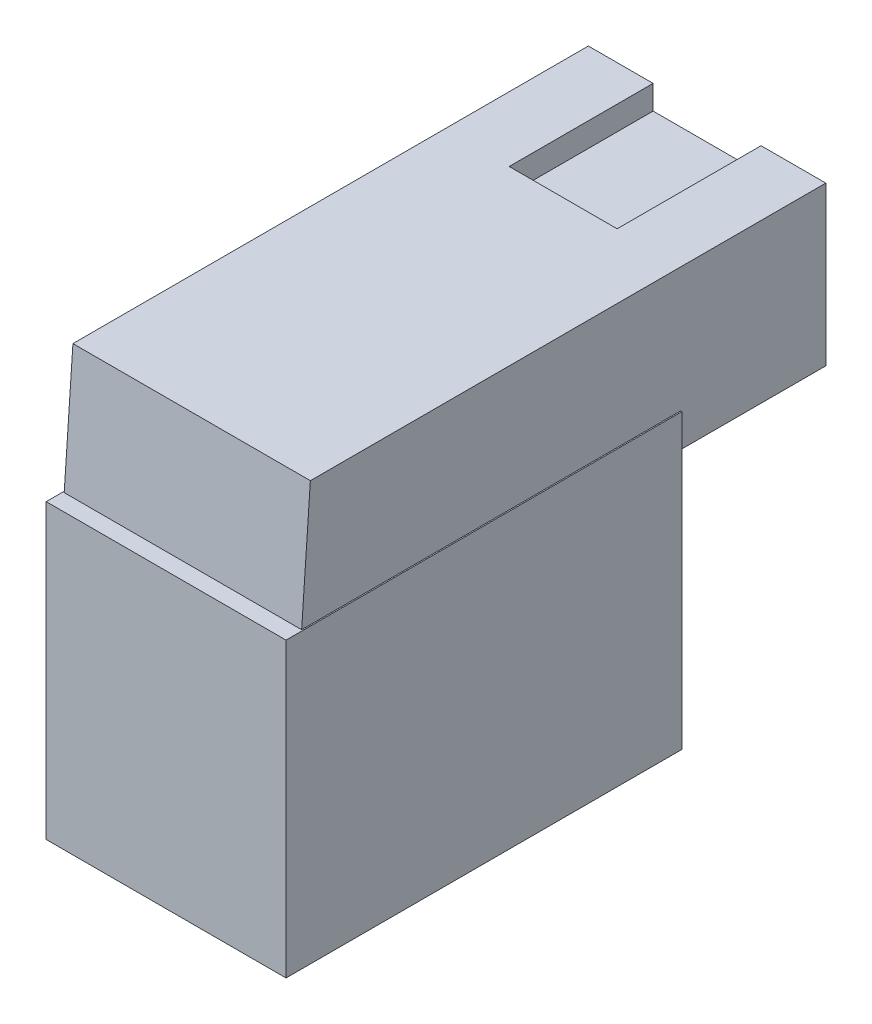
ISO-10303-21;
HEADER;
FILE_DESCRIPTION(('STEP AP214'),'2;1');
FILE_NAME('part.step','',(''),(''),'','','');
FILE_SCHEMA(('AUTOMOTIVE_DESIGN { 1 0 10303 214 1 1 1 1 }'));
ENDSEC;
DATA;
#1=APPLICATION_CONTEXT('core data for automotive mechanical design processes');
#2=APPLICATION_PROTOCOL_DEFINITION('international standard','automotive_design',2000,#1);
#3=PRODUCT_CONTEXT('',#1,'mechanical');
#4=PRODUCT('Part','Part','',(#3));
#5=PRODUCT_RELATED_PRODUCT_CATEGORY('part','',(#4));
#6=PRODUCT_DEFINITION_FORMATION('','',#4);
#7=PRODUCT_DEFINITION_CONTEXT('part definition',#1,'design');
#8=PRODUCT_DEFINITION('design','',#6,#7);
#9=PRODUCT_DEFINITION_SHAPE('','',#8);
#10=(LENGTH_UNIT() NAMED_UNIT(*) SI_UNIT(.MILLI.,.METRE.));
#11=(NAMED_UNIT(*) PLANE_ANGLE_UNIT() SI_UNIT($,.RADIAN.));
#12=(NAMED_UNIT(*) SI_UNIT($,.STERADIAN.) SOLID_ANGLE_UNIT());
#13=UNCERTAINTY_MEASURE_WITH_UNIT(LENGTH_MEASURE(1.E-05),#10,'distance_accuracy_value','');
#14=(GEOMETRIC_REPRESENTATION_CONTEXT(3) GLOBAL_UNCERTAINTY_ASSIGNED_CONTEXT((#13)) GLOBAL_UNIT_ASSIGNED_CONTEXT((#10,
#11,#12)) REPRESENTATION_CONTEXT('',''));
#15=CARTESIAN_POINT('',(0.,0.,0.));
#16=DIRECTION('',(0.,0.,1.));
#17=DIRECTION('',(1.,0.,0.));
#18=AXIS2_PLACEMENT_3D('',#15,#16,#17);
#19=CARTESIAN_POINT('',(0.,0.,-16.5536194221063));
#20=DIRECTION('',(0.,0.,1.));
#21=DIRECTION('',(1.,0.,0.));
#22=AXIS2_PLACEMENT_3D('',#19,#20,#21);
#23=PLANE('',#22);
#24=DIRECTION('',(0.,-1.,0.));
#25=VECTOR('',#24,1.);
#26=CARTESIAN_POINT('',(1.75,14.3,-16.5536194221063));
#27=LINE('',#26,#25);
#28=CARTESIAN_POINT('',(1.75,14.3,-16.5536194221063));
#29=VERTEX_POINT('',#28);
#30=CARTESIAN_POINT('',(1.75,13.3,-16.5536194221063));
#31=VERTEX_POINT('',#30);
#32=EDGE_CURVE('E258',#29,#31,#27,.T.);
#33=ORIENTED_EDGE('',*,*,#32,.F.);
#34=DIRECTION('',(1.,0.,0.));
#35=VECTOR('',#34,1.);
#36=CARTESIAN_POINT('',(1.75,14.3,-16.5536194221063));
#37=LINE('',#36,#35);
#38=CARTESIAN_POINT('',(0.749999999999999,14.3,-16.5536194221063));
#39=VERTEX_POINT('',#38);
#40=EDGE_CURVE('E275',#39,#29,#37,.T.);
#41=ORIENTED_EDGE('',*,*,#40,.F.);
#42=DIRECTION('',(0.,1.,0.));
#43=VECTOR('',#42,1.);
#44=CARTESIAN_POINT('',(0.749999999999999,14.3,-16.5536194221063));
#45=LINE('',#44,#43);
#46=CARTESIAN_POINT('',(0.749999999999999,13.3,-16.5536194221063));
#47=VERTEX_POINT('',#46);
#48=EDGE_CURVE('E284',#47,#39,#45,.T.);
#49=ORIENTED_EDGE('',*,*,#48,.F.);
#50=DIRECTION('',(-1.,0.,0.));
#51=VECTOR('',#50,1.);
#52=CARTESIAN_POINT('',(1.75,13.3,-16.5536194221063));
#53=LINE('',#52,#51);
#54=EDGE_CURVE('E261',#31,#47,#53,.T.);
#55=ORIENTED_EDGE('',*,*,#54,.F.);
#56=EDGE_LOOP('',(#33,#41,#49,#55));
#57=FACE_BOUND('',#56,.T.);
#58=DIRECTION('',(0.,-1.,0.));
#59=VECTOR('',#58,1.);
#60=CARTESIAN_POINT('',(3.45,13.6,-16.5536194221063));
#61=LINE('',#60,#59);
#62=CARTESIAN_POINT('',(3.45,15.1,-16.5536194221063));
#63=VERTEX_POINT('',#62);
#64=CARTESIAN_POINT('',(3.45,13.6,-16.5536194221063));
#65=VERTEX_POINT('',#64);
#66=EDGE_CURVE('E296',#63,#65,#61,.T.);
#67=ORIENTED_EDGE('',*,*,#66,.T.);
#68=DIRECTION('',(-1.,0.,0.));
#69=VECTOR('',#68,1.);
#70=CARTESIAN_POINT('',(2.9,13.6,-16.5536194221063));
#71=LINE('',#70,#69);
#72=CARTESIAN_POINT('',(2.9,13.6,-16.5536194221063));
#73=VERTEX_POINT('',#72);
#74=EDGE_CURVE('E301',#65,#73,#71,.T.);
#75=ORIENTED_EDGE('',*,*,#74,.T.);
#76=DIRECTION('',(0.,-1.,0.));
#77=VECTOR('',#76,1.);
#78=CARTESIAN_POINT('',(2.9,11.9,-16.5536194221063));
#79=LINE('',#78,#77);
#80=CARTESIAN_POINT('',(2.9,11.9,-16.5536194221063));
#81=VERTEX_POINT('',#80);
#82=EDGE_CURVE('E304',#73,#81,#79,.T.);
#83=ORIENTED_EDGE('',*,*,#82,.T.);
#84=DIRECTION('',(-1.,0.,0.));
#85=VECTOR('',#84,1.);
#86=CARTESIAN_POINT('',(-2.9,11.9,-16.5536194221063));
#87=LINE('',#86,#85);
#88=CARTESIAN_POINT('',(-2.9,11.9,-16.5536194221063));
#89=VERTEX_POINT('',#88);
#90=EDGE_CURVE('E308',#81,#89,#87,.T.);
#91=ORIENTED_EDGE('',*,*,#90,.T.);
#92=DIRECTION('',(0.,1.,0.));
#93=VECTOR('',#92,1.);
#94=CARTESIAN_POINT('',(-2.9,13.6,-16.5536194221063));
#95=LINE('',#94,#93);
#96=CARTESIAN_POINT('',(-2.9,13.6,-16.5536194221063));
#97=VERTEX_POINT('',#96);
#98=EDGE_CURVE('E311',#89,#97,#95,.T.);
#99=ORIENTED_EDGE('',*,*,#98,.T.);
#100=DIRECTION('',(-1.,0.,0.));
#101=VECTOR('',#100,1.);
#102=CARTESIAN_POINT('',(-3.45,13.6,-16.5536194221063));
#103=LINE('',#102,#101);
#104=CARTESIAN_POINT('',(-3.45,13.6,-16.5536194221063));
#105=VERTEX_POINT('',#104);
#106=EDGE_CURVE('E313',#97,#105,#103,.T.);
#107=ORIENTED_EDGE('',*,*,#106,.T.);
#108=DIRECTION('',(0.,1.,0.));
#109=VECTOR('',#108,1.);
#110=CARTESIAN_POINT('',(-3.45,15.1,-16.5536194221063));
#111=LINE('',#110,#109);
#112=CARTESIAN_POINT('',(-3.45,15.1,-16.5536194221063));
#113=VERTEX_POINT('',#112);
#114=EDGE_CURVE('E320',#105,#113,#111,.T.);
#115=ORIENTED_EDGE('',*,*,#114,.T.);
#116=DIRECTION('',(1.,0.,0.));
#117=VECTOR('',#116,1.);
#118=CARTESIAN_POINT('',(3.45,15.1,-16.5536194221063));
#119=LINE('',#118,#117);
#120=EDGE_CURVE('E318',#113,#63,#119,.T.);
#121=ORIENTED_EDGE('',*,*,#120,.T.);
#122=EDGE_LOOP('',(#67,#75,#83,#91,#99,#107,#115,#121));
#123=FACE_BOUND('',#122,.T.);
#124=DIRECTION('',(0.,-1.,0.));
#125=VECTOR('',#124,1.);
#126=CARTESIAN_POINT('',(-0.750000000000001,14.3,-16.5536194221063));
#127=LINE('',#126,#125);
#128=CARTESIAN_POINT('',(-0.750000000000001,14.3,-16.5536194221063));
#129=VERTEX_POINT('',#128);
#130=CARTESIAN_POINT('',(-0.750000000000001,13.3,-16.5536194221063));
#131=VERTEX_POINT('',#130);
#132=EDGE_CURVE('E260',#129,#131,#127,.T.);
#133=ORIENTED_EDGE('',*,*,#132,.F.);
#134=DIRECTION('',(1.,0.,0.));
#135=VECTOR('',#134,1.);
#136=CARTESIAN_POINT('',(-0.750000000000001,14.3,-16.5536194221063));
#137=LINE('',#136,#135);
#138=CARTESIAN_POINT('',(-1.75,14.3,-16.5536194221063));
#139=VERTEX_POINT('',#138);
#140=EDGE_CURVE('E253',#139,#129,#137,.T.);
#141=ORIENTED_EDGE('',*,*,#140,.F.);
#142=DIRECTION('',(0.,1.,0.));
#143=VECTOR('',#142,1.);
#144=CARTESIAN_POINT('',(-1.75,14.3,-16.5536194221063));
#145=LINE('',#144,#143);
#146=CARTESIAN_POINT('',(-1.75,13.3,-16.5536194221063));
#147=VERTEX_POINT('',#146);
#148=EDGE_CURVE('E64',#147,#139,#145,.T.);
#149=ORIENTED_EDGE('',*,*,#148,.F.);
#150=DIRECTION('',(-1.,0.,0.));
#151=VECTOR('',#150,1.);
#152=CARTESIAN_POINT('',(-0.750000000000001,13.3,-16.5536194221063));
#153=LINE('',#152,#151);
#154=EDGE_CURVE('E57',#131,#147,#153,.T.);
#155=ORIENTED_EDGE('',*,*,#154,.F.);
#156=EDGE_LOOP('',(#133,#141,#149,#155));
#157=FACE_BOUND('',#156,.T.);
#158=ADVANCED_FACE('F41',(#57,#123,#157),#23,.F.);
#159=CARTESIAN_POINT('',(-5.,12.2,0.));
#160=DIRECTION('',(1.,0.,0.));
#161=DIRECTION('',(0.,0.,-1.));
#162=AXIS2_PLACEMENT_3D('',#159,#160,#161);
#163=PLANE('',#162);
#164=DIRECTION('',(0.,0.,1.));
#165=VECTOR('',#164,1.);
#166=CARTESIAN_POINT('',(-5.,0.,0.));
#167=LINE('',#166,#165);
#168=CARTESIAN_POINT('',(-5.,0.,-16.5));
#169=VERTEX_POINT('',#168);
#170=CARTESIAN_POINT('',(-5.,0.,0.));
#171=VERTEX_POINT('',#170);
#172=EDGE_CURVE('E433',#169,#171,#167,.T.);
#173=ORIENTED_EDGE('',*,*,#172,.T.);
#174=DIRECTION('',(0.,-1.,0.));
#175=VECTOR('',#174,1.);
#176=CARTESIAN_POINT('',(-5.,12.2,0.));
#177=LINE('',#176,#175);
#178=CARTESIAN_POINT('',(-5.,12.2,0.));
#179=VERTEX_POINT('',#178);
#180=EDGE_CURVE('E11',#179,#171,#177,.T.);
#181=ORIENTED_EDGE('',*,*,#180,.F.);
#182=DIRECTION('',(0.,0.,1.));
#183=VECTOR('',#182,1.);
#184=CARTESIAN_POINT('',(-5.,12.2,0.));
#185=LINE('',#184,#183);
#186=CARTESIAN_POINT('',(-5.,12.2,-16.5));
#187=VERTEX_POINT('',#186);
#188=EDGE_CURVE('E432',#187,#179,#185,.T.);
#189=ORIENTED_EDGE('',*,*,#188,.F.);
#190=DIRECTION('',(0.,-1.,0.));
#191=VECTOR('',#190,1.);
#192=CARTESIAN_POINT('',(-5.,12.2,-16.5));
#193=LINE('',#192,#191);
#194=EDGE_CURVE('E447',#187,#169,#193,.T.);
#195=ORIENTED_EDGE('',*,*,#194,.T.);
#196=EDGE_LOOP('',(#173,#181,#189,#195));
#197=FACE_BOUND('',#196,.T.);
#198=ADVANCED_FACE('F43',(#197),#163,.F.);
#199=CARTESIAN_POINT('',(-5.,12.2,0.));
#200=DIRECTION('',(0.,0.,-1.));
#201=DIRECTION('',(-1.,0.,0.));
#202=AXIS2_PLACEMENT_3D('',#199,#200,#201);
#203=PLANE('',#202);
#204=DIRECTION('',(1.,0.,0.));
#205=VECTOR('',#204,1.);
#206=CARTESIAN_POINT('',(-5.,0.,0.));
#207=LINE('',#206,#205);
#208=CARTESIAN_POINT('',(5.,0.,0.));
#209=VERTEX_POINT('',#208);
#210=EDGE_CURVE('E446',#171,#209,#207,.T.);
#211=ORIENTED_EDGE('',*,*,#210,.T.);
#212=DIRECTION('',(0.,-1.,0.));
#213=VECTOR('',#212,1.);
#214=CARTESIAN_POINT('',(5.,12.2,0.));
#215=LINE('',#214,#213);
#216=CARTESIAN_POINT('',(5.,12.2,0.));
#217=VERTEX_POINT('',#216);
#218=EDGE_CURVE('E47',#217,#209,#215,.T.);
#219=ORIENTED_EDGE('',*,*,#218,.F.);
#220=DIRECTION('',(1.,0.,0.));
#221=VECTOR('',#220,1.);
#222=CARTESIAN_POINT('',(-5.,12.2,0.));
#223=LINE('',#222,#221);
#224=EDGE_CURVE('E440',#179,#217,#223,.T.);
#225=ORIENTED_EDGE('',*,*,#224,.F.);
#226=ORIENTED_EDGE('',*,*,#180,.T.);
#227=EDGE_LOOP('',(#211,#219,#225,#226));
#228=FACE_BOUND('',#227,.T.);
#229=ADVANCED_FACE('F541',(#228),#203,.F.);
#230=CARTESIAN_POINT('',(5.,12.2,0.));
#231=DIRECTION('',(-1.,0.,0.));
#232=DIRECTION('',(0.,0.,1.));
#233=AXIS2_PLACEMENT_3D('',#230,#231,#232);
#234=PLANE('',#233);
#235=DIRECTION('',(0.,0.,-1.));
#236=VECTOR('',#235,1.);
#237=CARTESIAN_POINT('',(5.,0.,0.));
#238=LINE('',#237,#236);
#239=CARTESIAN_POINT('',(5.,0.,-16.5));
#240=VERTEX_POINT('',#239);
#241=EDGE_CURVE('E454',#209,#240,#238,.T.);
#242=ORIENTED_EDGE('',*,*,#241,.T.);
#243=DIRECTION('',(0.,-1.,0.));
#244=VECTOR('',#243,1.);
#245=CARTESIAN_POINT('',(5.,12.2,-16.5));
#246=LINE('',#245,#244);
#247=CARTESIAN_POINT('',(5.,12.2,-16.5));
#248=VERTEX_POINT('',#247);
#249=EDGE_CURVE('E459',#248,#240,#246,.T.);
#250=ORIENTED_EDGE('',*,*,#249,.F.);
#251=DIRECTION('',(0.,0.,-1.));
#252=VECTOR('',#251,1.);
#253=CARTESIAN_POINT('',(5.,12.2,0.));
#254=LINE('',#253,#252);
#255=EDGE_CURVE('E439',#217,#248,#254,.T.);
#256=ORIENTED_EDGE('',*,*,#255,.F.);
#257=ORIENTED_EDGE('',*,*,#218,.T.);
#258=EDGE_LOOP('',(#242,#250,#256,#257));
#259=FACE_BOUND('',#258,.T.);
#260=ADVANCED_FACE('F461',(#259),#234,.F.);
#261=CARTESIAN_POINT('',(-5.,12.2,-16.5));
#262=DIRECTION('',(0.,0.,1.));
#263=DIRECTION('',(1.,0.,0.));
#264=AXIS2_PLACEMENT_3D('',#261,#262,#263);
#265=PLANE('',#264);
#266=DIRECTION('',(-1.,0.,0.));
#267=VECTOR('',#266,1.);
#268=CARTESIAN_POINT('',(4.95,10.8,-16.5));
#269=LINE('',#268,#267);
#270=CARTESIAN_POINT('',(4.95,10.8,-16.5));
#271=VERTEX_POINT('',#270);
#272=CARTESIAN_POINT('',(-4.95,10.8,-16.5));
#273=VERTEX_POINT('',#272);
#274=EDGE_CURVE('E427',#271,#273,#269,.T.);
#275=ORIENTED_EDGE('',*,*,#274,.F.);
#276=DIRECTION('',(0.,-1.,0.));
#277=VECTOR('',#276,1.);
#278=CARTESIAN_POINT('',(4.95,10.8,-16.5));
#279=LINE('',#278,#277);
#280=CARTESIAN_POINT('',(4.95,12.2,-16.5));
#281=VERTEX_POINT('',#280);
#282=EDGE_CURVE('E395',#281,#271,#279,.T.);
#283=ORIENTED_EDGE('',*,*,#282,.F.);
#284=DIRECTION('',(-1.,0.,0.));
#285=VECTOR('',#284,1.);
#286=CARTESIAN_POINT('',(-5.,12.2,-16.5));
#287=LINE('',#286,#285);
#288=EDGE_CURVE('E442',#248,#281,#287,.T.);
#289=ORIENTED_EDGE('',*,*,#288,.F.);
#290=ORIENTED_EDGE('',*,*,#249,.T.);
#291=DIRECTION('',(-1.,0.,0.));
#292=VECTOR('',#291,1.);
#293=CARTESIAN_POINT('',(-5.,0.,-16.5));
#294=LINE('',#293,#292);
#295=EDGE_CURVE('E438',#240,#169,#294,.T.);
#296=ORIENTED_EDGE('',*,*,#295,.T.);
#297=ORIENTED_EDGE('',*,*,#194,.F.);
#298=CARTESIAN_POINT('',(-4.95,12.2,-16.5));
#299=VERTEX_POINT('',#298);
#300=EDGE_CURVE('E445',#299,#187,#287,.T.);
#301=ORIENTED_EDGE('',*,*,#300,.F.);
#302=DIRECTION('',(0.,-1.,0.));
#303=VECTOR('',#302,1.);
#304=CARTESIAN_POINT('',(-4.95,10.8,-16.5));
#305=LINE('',#304,#303);
#306=EDGE_CURVE('E410',#299,#273,#305,.T.);
#307=ORIENTED_EDGE('',*,*,#306,.T.);
#308=EDGE_LOOP('',(#275,#283,#289,#290,#296,#297,#301,#307));
#309=FACE_BOUND('',#308,.T.);
#310=ADVANCED_FACE('F471',(#309),#265,.F.);
#311=CARTESIAN_POINT('',(0.,12.2,0.));
#312=DIRECTION('',(0.,-1.,0.));
#313=DIRECTION('',(0.,0.,-1.));
#314=AXIS2_PLACEMENT_3D('',#311,#312,#313);
#315=PLANE('',#314);
#316=ORIENTED_EDGE('',*,*,#288,.T.);
#317=DIRECTION('',(0.,0.,-1.));
#318=VECTOR('',#317,1.);
#319=CARTESIAN_POINT('',(4.95,12.2,-16.5));
#320=LINE('',#319,#318);
#321=CARTESIAN_POINT('',(4.95,12.2,-0.7));
#322=VERTEX_POINT('',#321);
#323=EDGE_CURVE('E387',#322,#281,#320,.T.);
#324=ORIENTED_EDGE('',*,*,#323,.F.);
#325=DIRECTION('',(-1.,0.,0.));
#326=VECTOR('',#325,1.);
#327=CARTESIAN_POINT('',(4.95,12.2,-0.7));
#328=LINE('',#327,#326);
#329=CARTESIAN_POINT('',(-4.95,12.2,-0.7));
#330=VERTEX_POINT('',#329);
#331=EDGE_CURVE('E409',#322,#330,#328,.T.);
#332=ORIENTED_EDGE('',*,*,#331,.T.);
#333=DIRECTION('',(0.,0.,-1.));
#334=VECTOR('',#333,1.);
#335=CARTESIAN_POINT('',(-4.95,12.2,-16.5));
#336=LINE('',#335,#334);
#337=EDGE_CURVE('E384',#330,#299,#336,.T.);
#338=ORIENTED_EDGE('',*,*,#337,.T.);
#339=ORIENTED_EDGE('',*,*,#300,.T.);
#340=ORIENTED_EDGE('',*,*,#188,.T.);
#341=ORIENTED_EDGE('',*,*,#224,.T.);
#342=ORIENTED_EDGE('',*,*,#255,.T.);
#343=EDGE_LOOP('',(#316,#324,#332,#338,#339,#340,#341,#342));
#344=FACE_BOUND('',#343,.T.);
#345=ADVANCED_FACE('F478',(#344),#315,.F.);
#346=CARTESIAN_POINT('',(0.,0.,0.));
#347=DIRECTION('',(0.,-1.,0.));
#348=DIRECTION('',(0.,0.,-1.));
#349=AXIS2_PLACEMENT_3D('',#346,#347,#348);
#350=PLANE('',#349);
#351=ORIENTED_EDGE('',*,*,#172,.F.);
#352=ORIENTED_EDGE('',*,*,#295,.F.);
#353=ORIENTED_EDGE('',*,*,#241,.F.);
#354=ORIENTED_EDGE('',*,*,#210,.F.);
#355=EDGE_LOOP('',(#351,#352,#353,#354));
#356=FACE_BOUND('',#355,.T.);
#357=ADVANCED_FACE('F469',(#356),#350,.T.);
#358=CARTESIAN_POINT('',(4.95,10.8,-22.5536194221063));
#359=DIRECTION('',(0.,1.,0.));
#360=DIRECTION('',(0.,0.,1.));
#361=AXIS2_PLACEMENT_3D('',#358,#359,#360);
#362=PLANE('',#361);
#363=DIRECTION('',(0.,0.,-1.));
#364=VECTOR('',#363,1.);
#365=CARTESIAN_POINT('',(-4.95,10.8,-22.5536194221063));
#366=LINE('',#365,#364);
#367=CARTESIAN_POINT('',(-4.95,10.8,-22.5536194221063));
#368=VERTEX_POINT('',#367);
#369=EDGE_CURVE('E407',#273,#368,#366,.T.);
#370=ORIENTED_EDGE('',*,*,#369,.T.);
#371=DIRECTION('',(-1.,0.,0.));
#372=VECTOR('',#371,1.);
#373=CARTESIAN_POINT('',(4.95,10.8,-22.5536194221063));
#374=LINE('',#373,#372);
#375=CARTESIAN_POINT('',(4.95,10.8,-22.5536194221063));
#376=VERTEX_POINT('',#375);
#377=EDGE_CURVE('E430',#376,#368,#374,.T.);
#378=ORIENTED_EDGE('',*,*,#377,.F.);
#379=DIRECTION('',(0.,0.,-1.));
#380=VECTOR('',#379,1.);
#381=CARTESIAN_POINT('',(4.95,10.8,-22.5536194221063));
#382=LINE('',#381,#380);
#383=EDGE_CURVE('E400',#271,#376,#382,.T.);
#384=ORIENTED_EDGE('',*,*,#383,.F.);
#385=ORIENTED_EDGE('',*,*,#274,.T.);
#386=EDGE_LOOP('',(#370,#378,#384,#385));
#387=FACE_BOUND('',#386,.T.);
#388=ADVANCED_FACE('F489',(#387),#362,.F.);
#389=CARTESIAN_POINT('',(4.95,17.4,-22.5536194221063));
#390=DIRECTION('',(0.,0.,1.));
#391=DIRECTION('',(1.,0.,0.));
#392=AXIS2_PLACEMENT_3D('',#389,#390,#391);
#393=PLANE('',#392);
#394=DIRECTION('',(-1.,0.,0.));
#395=VECTOR('',#394,1.);
#396=CARTESIAN_POINT('',(2.9,13.6,-22.5536194221063));
#397=LINE('',#396,#395);
#398=CARTESIAN_POINT('',(3.45,13.6,-22.5536194221063));
#399=VERTEX_POINT('',#398);
#400=CARTESIAN_POINT('',(2.9,13.6,-22.5536194221063));
#401=VERTEX_POINT('',#400);
#402=EDGE_CURVE('E322',#399,#401,#397,.T.);
#403=ORIENTED_EDGE('',*,*,#402,.F.);
#404=DIRECTION('',(0.,-1.,0.));
#405=VECTOR('',#404,1.);
#406=CARTESIAN_POINT('',(3.45,13.6,-22.5536194221063));
#407=LINE('',#406,#405);
#408=CARTESIAN_POINT('',(3.45,15.1,-22.5536194221063));
#409=VERTEX_POINT('',#408);
#410=EDGE_CURVE('E300',#409,#399,#407,.T.);
#411=ORIENTED_EDGE('',*,*,#410,.F.);
#412=DIRECTION('',(1.,0.,0.));
#413=VECTOR('',#412,1.);
#414=CARTESIAN_POINT('',(3.45,15.1,-22.5536194221063));
#415=LINE('',#414,#413);
#416=CARTESIAN_POINT('',(-3.45,15.1,-22.5536194221063));
#417=VERTEX_POINT('',#416);
#418=EDGE_CURVE('E305',#417,#409,#415,.T.);
#419=ORIENTED_EDGE('',*,*,#418,.F.);
#420=DIRECTION('',(0.,1.,0.));
#421=VECTOR('',#420,1.);
#422=CARTESIAN_POINT('',(-3.45,15.1,-22.5536194221063));
#423=LINE('',#422,#421);
#424=CARTESIAN_POINT('',(-3.45,13.6,-22.5536194221063));
#425=VERTEX_POINT('',#424);
#426=EDGE_CURVE('E338',#425,#417,#423,.T.);
#427=ORIENTED_EDGE('',*,*,#426,.F.);
#428=DIRECTION('',(-1.,0.,0.));
#429=VECTOR('',#428,1.);
#430=CARTESIAN_POINT('',(-3.45,13.6,-22.5536194221063));
#431=LINE('',#430,#429);
#432=CARTESIAN_POINT('',(-2.9,13.6,-22.5536194221063));
#433=VERTEX_POINT('',#432);
#434=EDGE_CURVE('E340',#433,#425,#431,.T.);
#435=ORIENTED_EDGE('',*,*,#434,.F.);
#436=DIRECTION('',(0.,1.,0.));
#437=VECTOR('',#436,1.);
#438=CARTESIAN_POINT('',(-2.9,13.6,-22.5536194221063));
#439=LINE('',#438,#437);
#440=CARTESIAN_POINT('',(-2.9,11.9,-22.5536194221063));
#441=VERTEX_POINT('',#440);
#442=EDGE_CURVE('E332',#441,#433,#439,.T.);
#443=ORIENTED_EDGE('',*,*,#442,.F.);
#444=DIRECTION('',(-1.,0.,0.));
#445=VECTOR('',#444,1.);
#446=CARTESIAN_POINT('',(-2.9,11.9,-22.5536194221063));
#447=LINE('',#446,#445);
#448=CARTESIAN_POINT('',(2.9,11.9,-22.5536194221063));
#449=VERTEX_POINT('',#448);
#450=EDGE_CURVE('E333',#449,#441,#447,.T.);
#451=ORIENTED_EDGE('',*,*,#450,.F.);
#452=DIRECTION('',(0.,-1.,0.));
#453=VECTOR('',#452,1.);
#454=CARTESIAN_POINT('',(2.9,11.9,-22.5536194221063));
#455=LINE('',#454,#453);
#456=EDGE_CURVE('E330',#401,#449,#455,.T.);
#457=ORIENTED_EDGE('',*,*,#456,.F.);
#458=EDGE_LOOP('',(#403,#411,#419,#427,#435,#443,#451,#457));
#459=FACE_BOUND('',#458,.T.);
#460=DIRECTION('',(-1.,0.,0.));
#461=VECTOR('',#460,1.);
#462=CARTESIAN_POINT('',(2.25,16.4,-22.5536194221063));
#463=LINE('',#462,#461);
#464=CARTESIAN_POINT('',(2.25,16.4,-22.5536194221063));
#465=VERTEX_POINT('',#464);
#466=CARTESIAN_POINT('',(-2.25,16.4,-22.5536194221063));
#467=VERTEX_POINT('',#466);
#468=EDGE_CURVE('E380',#465,#467,#463,.T.);
#469=ORIENTED_EDGE('',*,*,#468,.F.);
#470=DIRECTION('',(0.,-1.,0.));
#471=VECTOR('',#470,1.);
#472=CARTESIAN_POINT('',(2.25,17.4,-22.5536194221063));
#473=LINE('',#472,#471);
#474=CARTESIAN_POINT('',(2.25,17.4,-22.5536194221063));
#475=VERTEX_POINT('',#474);
#476=EDGE_CURVE('E346',#475,#465,#473,.T.);
#477=ORIENTED_EDGE('',*,*,#476,.F.);
#478=DIRECTION('',(-1.,0.,0.));
#479=VECTOR('',#478,1.);
#480=CARTESIAN_POINT('',(4.95,17.4,-22.5536194221063));
#481=LINE('',#480,#479);
#482=CARTESIAN_POINT('',(4.95,17.4,-22.5536194221063));
#483=VERTEX_POINT('',#482);
#484=EDGE_CURVE('E425',#483,#475,#481,.T.);
#485=ORIENTED_EDGE('',*,*,#484,.F.);
#486=DIRECTION('',(0.,1.,0.));
#487=VECTOR('',#486,1.);
#488=CARTESIAN_POINT('',(4.95,17.4,-22.5536194221063));
#489=LINE('',#488,#487);
#490=EDGE_CURVE('E397',#376,#483,#489,.T.);
#491=ORIENTED_EDGE('',*,*,#490,.F.);
#492=ORIENTED_EDGE('',*,*,#377,.T.);
#493=DIRECTION('',(0.,1.,0.));
#494=VECTOR('',#493,1.);
#495=CARTESIAN_POINT('',(-4.95,17.4,-22.5536194221063));
#496=LINE('',#495,#494);
#497=CARTESIAN_POINT('',(-4.95,17.4,-22.5536194221063));
#498=VERTEX_POINT('',#497);
#499=EDGE_CURVE('E411',#368,#498,#496,.T.);
#500=ORIENTED_EDGE('',*,*,#499,.T.);
#501=CARTESIAN_POINT('',(-2.25,17.4,-22.5536194221063));
#502=VERTEX_POINT('',#501);
#503=EDGE_CURVE('E421',#502,#498,#481,.T.);
#504=ORIENTED_EDGE('',*,*,#503,.F.);
#505=DIRECTION('',(0.,1.,0.));
#506=VECTOR('',#505,1.);
#507=CARTESIAN_POINT('',(-2.25,17.4,-22.5536194221063));
#508=LINE('',#507,#506);
#509=EDGE_CURVE('E366',#467,#502,#508,.T.);
#510=ORIENTED_EDGE('',*,*,#509,.F.);
#511=EDGE_LOOP('',(#469,#477,#485,#491,#492,#500,#504,#510));
#512=FACE_BOUND('',#511,.T.);
#513=ADVANCED_FACE('F492',(#459,#512),#393,.F.);
#514=CARTESIAN_POINT('',(4.95,17.4,-1.06361942210627));
#515=DIRECTION('',(0.,-1.,0.));
#516=DIRECTION('',(0.,0.,-1.));
#517=AXIS2_PLACEMENT_3D('',#514,#515,#516);
#518=PLANE('',#517);
#519=ORIENTED_EDGE('',*,*,#484,.T.);
#520=DIRECTION('',(0.,0.,-1.));
#521=VECTOR('',#520,1.);
#522=CARTESIAN_POINT('',(2.25,17.4,-16.5536194221063));
#523=LINE('',#522,#521);
#524=CARTESIAN_POINT('',(2.25,17.4,-16.5536194221063));
#525=VERTEX_POINT('',#524);
#526=EDGE_CURVE('E382',#525,#475,#523,.T.);
#527=ORIENTED_EDGE('',*,*,#526,.F.);
#528=DIRECTION('',(1.,0.,0.));
#529=VECTOR('',#528,1.);
#530=CARTESIAN_POINT('',(2.25,17.4,-16.5536194221063));
#531=LINE('',#530,#529);
#532=CARTESIAN_POINT('',(-2.25,17.4,-16.5536194221063));
#533=VERTEX_POINT('',#532);
#534=EDGE_CURVE('E371',#533,#525,#531,.T.);
#535=ORIENTED_EDGE('',*,*,#534,.F.);
#536=DIRECTION('',(0.,0.,-1.));
#537=VECTOR('',#536,1.);
#538=CARTESIAN_POINT('',(-2.25,17.4,-16.5536194221063));
#539=LINE('',#538,#537);
#540=EDGE_CURVE('E381',#533,#502,#539,.T.);
#541=ORIENTED_EDGE('',*,*,#540,.T.);
#542=ORIENTED_EDGE('',*,*,#503,.T.);
#543=DIRECTION('',(0.,0.,1.));
#544=VECTOR('',#543,1.);
#545=CARTESIAN_POINT('',(-4.95,17.4,-1.06361942210627));
#546=LINE('',#545,#544);
#547=CARTESIAN_POINT('',(-4.95,17.4,-1.06361942210627));
#548=VERTEX_POINT('',#547);
#549=EDGE_CURVE('E412',#498,#548,#546,.T.);
#550=ORIENTED_EDGE('',*,*,#549,.T.);
#551=DIRECTION('',(-1.,0.,0.));
#552=VECTOR('',#551,1.);
#553=CARTESIAN_POINT('',(4.95,17.4,-1.06361942210627));
#554=LINE('',#553,#552);
#555=CARTESIAN_POINT('',(4.95,17.4,-1.06361942210627));
#556=VERTEX_POINT('',#555);
#557=EDGE_CURVE('E419',#556,#548,#554,.T.);
#558=ORIENTED_EDGE('',*,*,#557,.F.);
#559=DIRECTION('',(0.,0.,1.));
#560=VECTOR('',#559,1.);
#561=CARTESIAN_POINT('',(4.95,17.4,-1.06361942210627));
#562=LINE('',#561,#560);
#563=EDGE_CURVE('E402',#483,#556,#562,.T.);
#564=ORIENTED_EDGE('',*,*,#563,.F.);
#565=EDGE_LOOP('',(#519,#527,#535,#541,#542,#550,#558,#564));
#566=FACE_BOUND('',#565,.T.);
#567=ADVANCED_FACE('F507',(#566),#518,.F.);
#568=CARTESIAN_POINT('',(4.95,12.2,-0.7));
#569=DIRECTION('',(0.,-0.069756473744129,-0.997564050259824));
#570=DIRECTION('',(0.,0.997564050259824,-0.069756473744129));
#571=AXIS2_PLACEMENT_3D('',#568,#569,#570);
#572=PLANE('',#571);
#573=DIRECTION('',(0.,-0.997564050259824,0.069756473744129));
#574=VECTOR('',#573,1.);
#575=CARTESIAN_POINT('',(-4.95,12.2,-0.7));
#576=LINE('',#575,#574);
#577=EDGE_CURVE('E393',#548,#330,#576,.T.);
#578=ORIENTED_EDGE('',*,*,#577,.T.);
#579=ORIENTED_EDGE('',*,*,#331,.F.);
#580=DIRECTION('',(0.,-0.997564050259824,0.069756473744129));
#581=VECTOR('',#580,1.);
#582=CARTESIAN_POINT('',(4.95,12.2,-0.7));
#583=LINE('',#582,#581);
#584=EDGE_CURVE('E401',#556,#322,#583,.T.);
#585=ORIENTED_EDGE('',*,*,#584,.F.);
#586=ORIENTED_EDGE('',*,*,#557,.T.);
#587=EDGE_LOOP('',(#578,#579,#585,#586));
#588=FACE_BOUND('',#587,.T.);
#589=ADVANCED_FACE('F506',(#588),#572,.F.);
#590=CARTESIAN_POINT('',(4.95,0.,0.));
#591=DIRECTION('',(1.,0.,0.));
#592=DIRECTION('',(0.,0.,-1.));
#593=AXIS2_PLACEMENT_3D('',#590,#591,#592);
#594=PLANE('',#593);
#595=ORIENTED_EDGE('',*,*,#323,.T.);
#596=ORIENTED_EDGE('',*,*,#282,.T.);
#597=ORIENTED_EDGE('',*,*,#383,.T.);
#598=ORIENTED_EDGE('',*,*,#490,.T.);
#599=ORIENTED_EDGE('',*,*,#563,.T.);
#600=ORIENTED_EDGE('',*,*,#584,.T.);
#601=EDGE_LOOP('',(#595,#596,#597,#598,#599,#600));
#602=FACE_BOUND('',#601,.T.);
#603=ADVANCED_FACE('F501',(#602),#594,.T.);
#604=CARTESIAN_POINT('',(-4.95,0.,0.));
#605=DIRECTION('',(1.,0.,0.));
#606=DIRECTION('',(0.,0.,-1.));
#607=AXIS2_PLACEMENT_3D('',#604,#605,#606);
#608=PLANE('',#607);
#609=ORIENTED_EDGE('',*,*,#337,.F.);
#610=ORIENTED_EDGE('',*,*,#577,.F.);
#611=ORIENTED_EDGE('',*,*,#549,.F.);
#612=ORIENTED_EDGE('',*,*,#499,.F.);
#613=ORIENTED_EDGE('',*,*,#369,.F.);
#614=ORIENTED_EDGE('',*,*,#306,.F.);
#615=EDGE_LOOP('',(#609,#610,#611,#612,#613,#614));
#616=FACE_BOUND('',#615,.T.);
#617=ADVANCED_FACE('F482',(#616),#608,.F.);
#618=CARTESIAN_POINT('',(2.25,17.4,-16.5536194221063));
#619=DIRECTION('',(1.,0.,0.));
#620=DIRECTION('',(0.,0.,-1.));
#621=AXIS2_PLACEMENT_3D('',#618,#619,#620);
#622=PLANE('',#621);
#623=ORIENTED_EDGE('',*,*,#476,.T.);
#624=DIRECTION('',(0.,0.,-1.));
#625=VECTOR('',#624,1.);
#626=CARTESIAN_POINT('',(2.25,16.4,-16.5536194221063));
#627=LINE('',#626,#625);
#628=CARTESIAN_POINT('',(2.25,16.4,-16.5536194221063));
#629=VERTEX_POINT('',#628);
#630=EDGE_CURVE('E372',#629,#465,#627,.T.);
#631=ORIENTED_EDGE('',*,*,#630,.F.);
#632=DIRECTION('',(0.,-1.,0.));
#633=VECTOR('',#632,1.);
#634=CARTESIAN_POINT('',(2.25,17.4,-16.5536194221063));
#635=LINE('',#634,#633);
#636=EDGE_CURVE('E365',#525,#629,#635,.T.);
#637=ORIENTED_EDGE('',*,*,#636,.F.);
#638=ORIENTED_EDGE('',*,*,#526,.T.);
#639=EDGE_LOOP('',(#623,#631,#637,#638));
#640=FACE_BOUND('',#639,.T.);
#641=ADVANCED_FACE('F518',(#640),#622,.F.);
#642=CARTESIAN_POINT('',(-2.25,17.4,-16.5536194221063));
#643=DIRECTION('',(-1.,0.,0.));
#644=DIRECTION('',(0.,0.,1.));
#645=AXIS2_PLACEMENT_3D('',#642,#643,#644);
#646=PLANE('',#645);
#647=ORIENTED_EDGE('',*,*,#509,.T.);
#648=ORIENTED_EDGE('',*,*,#540,.F.);
#649=DIRECTION('',(0.,1.,0.));
#650=VECTOR('',#649,1.);
#651=CARTESIAN_POINT('',(-2.25,17.4,-16.5536194221063));
#652=LINE('',#651,#650);
#653=CARTESIAN_POINT('',(-2.25,16.4,-16.5536194221063));
#654=VERTEX_POINT('',#653);
#655=EDGE_CURVE('E367',#654,#533,#652,.T.);
#656=ORIENTED_EDGE('',*,*,#655,.F.);
#657=DIRECTION('',(0.,0.,-1.));
#658=VECTOR('',#657,1.);
#659=CARTESIAN_POINT('',(-2.25,16.4,-16.5536194221063));
#660=LINE('',#659,#658);
#661=EDGE_CURVE('E386',#654,#467,#660,.T.);
#662=ORIENTED_EDGE('',*,*,#661,.T.);
#663=EDGE_LOOP('',(#647,#648,#656,#662));
#664=FACE_BOUND('',#663,.T.);
#665=ADVANCED_FACE('F514',(#664),#646,.F.);
#666=CARTESIAN_POINT('',(2.25,16.4,-16.5536194221063));
#667=DIRECTION('',(0.,-1.,0.));
#668=DIRECTION('',(0.,0.,-1.));
#669=AXIS2_PLACEMENT_3D('',#666,#667,#668);
#670=PLANE('',#669);
#671=ORIENTED_EDGE('',*,*,#468,.T.);
#672=ORIENTED_EDGE('',*,*,#661,.F.);
#673=DIRECTION('',(-1.,0.,0.));
#674=VECTOR('',#673,1.);
#675=CARTESIAN_POINT('',(2.25,16.4,-16.5536194221063));
#676=LINE('',#675,#674);
#677=EDGE_CURVE('E362',#629,#654,#676,.T.);
#678=ORIENTED_EDGE('',*,*,#677,.F.);
#679=ORIENTED_EDGE('',*,*,#630,.T.);
#680=EDGE_LOOP('',(#671,#672,#678,#679));
#681=FACE_BOUND('',#680,.T.);
#682=ADVANCED_FACE('F516',(#681),#670,.F.);
#683=CARTESIAN_POINT('',(0.,0.,-16.5536194221063));
#684=DIRECTION('',(0.,0.,-1.));
#685=DIRECTION('',(-1.,0.,0.));
#686=AXIS2_PLACEMENT_3D('',#683,#684,#685);
#687=PLANE('',#686);
#688=ORIENTED_EDGE('',*,*,#636,.T.);
#689=ORIENTED_EDGE('',*,*,#677,.T.);
#690=ORIENTED_EDGE('',*,*,#655,.T.);
#691=ORIENTED_EDGE('',*,*,#534,.T.);
#692=EDGE_LOOP('',(#688,#689,#690,#691));
#693=FACE_BOUND('',#692,.T.);
#694=ADVANCED_FACE('F521',(#693),#687,.T.);
#695=CARTESIAN_POINT('',(3.45,13.6,-16.5536194221063));
#696=DIRECTION('',(1.,0.,0.));
#697=DIRECTION('',(0.,0.,-1.));
#698=AXIS2_PLACEMENT_3D('',#695,#696,#697);
#699=PLANE('',#698);
#700=ORIENTED_EDGE('',*,*,#410,.T.);
#701=DIRECTION('',(0.,0.,-1.));
#702=VECTOR('',#701,1.);
#703=CARTESIAN_POINT('',(3.45,13.6,-16.5536194221063));
#704=LINE('',#703,#702);
#705=EDGE_CURVE('E325',#65,#399,#704,.T.);
#706=ORIENTED_EDGE('',*,*,#705,.F.);
#707=ORIENTED_EDGE('',*,*,#66,.F.);
#708=DIRECTION('',(0.,0.,-1.));
#709=VECTOR('',#708,1.);
#710=CARTESIAN_POINT('',(3.45,15.1,-16.5536194221063));
#711=LINE('',#710,#709);
#712=EDGE_CURVE('E342',#63,#409,#711,.T.);
#713=ORIENTED_EDGE('',*,*,#712,.T.);
#714=EDGE_LOOP('',(#700,#706,#707,#713));
#715=FACE_BOUND('',#714,.T.);
#716=ADVANCED_FACE('F523',(#715),#699,.F.);
#717=CARTESIAN_POINT('',(3.45,15.1,-16.5536194221063));
#718=DIRECTION('',(0.,1.,0.));
#719=DIRECTION('',(0.,0.,1.));
#720=AXIS2_PLACEMENT_3D('',#717,#718,#719);
#721=PLANE('',#720);
#722=ORIENTED_EDGE('',*,*,#418,.T.);
#723=ORIENTED_EDGE('',*,*,#712,.F.);
#724=ORIENTED_EDGE('',*,*,#120,.F.);
#725=DIRECTION('',(0.,0.,-1.));
#726=VECTOR('',#725,1.);
#727=CARTESIAN_POINT('',(-3.45,15.1,-16.5536194221063));
#728=LINE('',#727,#726);
#729=EDGE_CURVE('E350',#113,#417,#728,.T.);
#730=ORIENTED_EDGE('',*,*,#729,.T.);
#731=EDGE_LOOP('',(#722,#723,#724,#730));
#732=FACE_BOUND('',#731,.T.);
#733=ADVANCED_FACE('F529',(#732),#721,.F.);
#734=CARTESIAN_POINT('',(-3.45,15.1,-16.5536194221063));
#735=DIRECTION('',(-1.,0.,0.));
#736=DIRECTION('',(0.,0.,1.));
#737=AXIS2_PLACEMENT_3D('',#734,#735,#736);
#738=PLANE('',#737);
#739=ORIENTED_EDGE('',*,*,#426,.T.);
#740=ORIENTED_EDGE('',*,*,#729,.F.);
#741=ORIENTED_EDGE('',*,*,#114,.F.);
#742=DIRECTION('',(0.,0.,-1.));
#743=VECTOR('',#742,1.);
#744=CARTESIAN_POINT('',(-3.45,13.6,-16.5536194221063));
#745=LINE('',#744,#743);
#746=EDGE_CURVE('E347',#105,#425,#745,.T.);
#747=ORIENTED_EDGE('',*,*,#746,.T.);
#748=EDGE_LOOP('',(#739,#740,#741,#747));
#749=FACE_BOUND('',#748,.T.);
#750=ADVANCED_FACE('F549',(#749),#738,.F.);
#751=CARTESIAN_POINT('',(-3.45,13.6,-16.5536194221063));
#752=DIRECTION('',(0.,-1.,0.));
#753=DIRECTION('',(1.,0.,0.));
#754=AXIS2_PLACEMENT_3D('',#751,#752,#753);
#755=PLANE('',#754);
#756=ORIENTED_EDGE('',*,*,#434,.T.);
#757=ORIENTED_EDGE('',*,*,#746,.F.);
#758=ORIENTED_EDGE('',*,*,#106,.F.);
#759=DIRECTION('',(0.,0.,-1.));
#760=VECTOR('',#759,1.);
#761=CARTESIAN_POINT('',(-2.9,13.6,-16.5536194221063));
#762=LINE('',#761,#760);
#763=EDGE_CURVE('E355',#97,#433,#762,.T.);
#764=ORIENTED_EDGE('',*,*,#763,.T.);
#765=EDGE_LOOP('',(#756,#757,#758,#764));
#766=FACE_BOUND('',#765,.T.);
#767=ADVANCED_FACE('F555',(#766),#755,.F.);
#768=CARTESIAN_POINT('',(-2.9,13.6,-16.5536194221063));
#769=DIRECTION('',(-1.,0.,0.));
#770=DIRECTION('',(0.,-1.,0.));
#771=AXIS2_PLACEMENT_3D('',#768,#769,#770);
#772=PLANE('',#771);
#773=ORIENTED_EDGE('',*,*,#442,.T.);
#774=ORIENTED_EDGE('',*,*,#763,.F.);
#775=ORIENTED_EDGE('',*,*,#98,.F.);
#776=DIRECTION('',(0.,0.,-1.));
#777=VECTOR('',#776,1.);
#778=CARTESIAN_POINT('',(-2.9,11.9,-16.5536194221063));
#779=LINE('',#778,#777);
#780=EDGE_CURVE('E352',#89,#441,#779,.T.);
#781=ORIENTED_EDGE('',*,*,#780,.T.);
#782=EDGE_LOOP('',(#773,#774,#775,#781));
#783=FACE_BOUND('',#782,.T.);
#784=ADVANCED_FACE('F556',(#783),#772,.F.);
#785=CARTESIAN_POINT('',(-2.9,11.9,-16.5536194221063));
#786=DIRECTION('',(0.,-1.,0.));
#787=DIRECTION('',(0.,0.,-1.));
#788=AXIS2_PLACEMENT_3D('',#785,#786,#787);
#789=PLANE('',#788);
#790=ORIENTED_EDGE('',*,*,#450,.T.);
#791=ORIENTED_EDGE('',*,*,#780,.F.);
#792=ORIENTED_EDGE('',*,*,#90,.F.);
#793=DIRECTION('',(0.,0.,-1.));
#794=VECTOR('',#793,1.);
#795=CARTESIAN_POINT('',(2.9,11.9,-16.5536194221063));
#796=LINE('',#795,#794);
#797=EDGE_CURVE('E358',#81,#449,#796,.T.);
#798=ORIENTED_EDGE('',*,*,#797,.T.);
#799=EDGE_LOOP('',(#790,#791,#792,#798));
#800=FACE_BOUND('',#799,.T.);
#801=ADVANCED_FACE('F565',(#800),#789,.F.);
#802=CARTESIAN_POINT('',(2.9,11.9,-16.5536194221063));
#803=DIRECTION('',(1.,0.,0.));
#804=DIRECTION('',(0.,1.,0.));
#805=AXIS2_PLACEMENT_3D('',#802,#803,#804);
#806=PLANE('',#805);
#807=ORIENTED_EDGE('',*,*,#456,.T.);
#808=ORIENTED_EDGE('',*,*,#797,.F.);
#809=ORIENTED_EDGE('',*,*,#82,.F.);
#810=DIRECTION('',(0.,0.,-1.));
#811=VECTOR('',#810,1.);
#812=CARTESIAN_POINT('',(2.9,13.6,-16.5536194221063));
#813=LINE('',#812,#811);
#814=EDGE_CURVE('E356',#73,#401,#813,.T.);
#815=ORIENTED_EDGE('',*,*,#814,.T.);
#816=EDGE_LOOP('',(#807,#808,#809,#815));
#817=FACE_BOUND('',#816,.T.);
#818=ADVANCED_FACE('F566',(#817),#806,.F.);
#819=CARTESIAN_POINT('',(2.9,13.6,-16.5536194221063));
#820=DIRECTION('',(0.,-1.,0.));
#821=DIRECTION('',(1.,0.,0.));
#822=AXIS2_PLACEMENT_3D('',#819,#820,#821);
#823=PLANE('',#822);
#824=ORIENTED_EDGE('',*,*,#402,.T.);
#825=ORIENTED_EDGE('',*,*,#814,.F.);
#826=ORIENTED_EDGE('',*,*,#74,.F.);
#827=ORIENTED_EDGE('',*,*,#705,.T.);
#828=EDGE_LOOP('',(#824,#825,#826,#827));
#829=FACE_BOUND('',#828,.T.);
#830=ADVANCED_FACE('F569',(#829),#823,.F.);
#831=CARTESIAN_POINT('',(1.75,14.3,-21.5536194221063));
#832=DIRECTION('',(-1.,0.,0.));
#833=DIRECTION('',(0.,0.,1.));
#834=AXIS2_PLACEMENT_3D('',#831,#832,#833);
#835=PLANE('',#834);
#836=ORIENTED_EDGE('',*,*,#32,.T.);
#837=DIRECTION('',(0.,0.,1.));
#838=VECTOR('',#837,1.);
#839=CARTESIAN_POINT('',(1.75,13.3,-21.5536194221063));
#840=LINE('',#839,#838);
#841=CARTESIAN_POINT('',(1.75,13.3,-21.5536194221063));
#842=VERTEX_POINT('',#841);
#843=EDGE_CURVE('E295',#842,#31,#840,.T.);
#844=ORIENTED_EDGE('',*,*,#843,.F.);
#845=DIRECTION('',(0.,-1.,0.));
#846=VECTOR('',#845,1.);
#847=CARTESIAN_POINT('',(1.75,14.3,-21.5536194221063));
#848=LINE('',#847,#846);
#849=CARTESIAN_POINT('',(1.75,14.3,-21.5536194221063));
#850=VERTEX_POINT('',#849);
#851=EDGE_CURVE('E266',#850,#842,#848,.T.);
#852=ORIENTED_EDGE('',*,*,#851,.F.);
#853=DIRECTION('',(0.,0.,1.));
#854=VECTOR('',#853,1.);
#855=CARTESIAN_POINT('',(1.75,14.3,-21.5536194221063));
#856=LINE('',#855,#854);
#857=EDGE_CURVE('E276',#850,#29,#856,.T.);
#858=ORIENTED_EDGE('',*,*,#857,.T.);
#859=EDGE_LOOP('',(#836,#844,#852,#858));
#860=FACE_BOUND('',#859,.T.);
#861=ADVANCED_FACE('F548',(#860),#835,.F.);
#862=CARTESIAN_POINT('',(1.75,13.3,-21.5536194221063));
#863=DIRECTION('',(0.,1.,0.));
#864=DIRECTION('',(0.,0.,1.));
#865=AXIS2_PLACEMENT_3D('',#862,#863,#864);
#866=PLANE('',#865);
#867=ORIENTED_EDGE('',*,*,#54,.T.);
#868=DIRECTION('',(0.,0.,1.));
#869=VECTOR('',#868,1.);
#870=CARTESIAN_POINT('',(0.749999999999999,13.3,-21.5536194221063));
#871=LINE('',#870,#869);
#872=CARTESIAN_POINT('',(0.749999999999999,13.3,-21.5536194221063));
#873=VERTEX_POINT('',#872);
#874=EDGE_CURVE('E293',#873,#47,#871,.T.);
#875=ORIENTED_EDGE('',*,*,#874,.F.);
#876=DIRECTION('',(-1.,0.,0.));
#877=VECTOR('',#876,1.);
#878=CARTESIAN_POINT('',(1.75,13.3,-21.5536194221063));
#879=LINE('',#878,#877);
#880=EDGE_CURVE('E272',#842,#873,#879,.T.);
#881=ORIENTED_EDGE('',*,*,#880,.F.);
#882=ORIENTED_EDGE('',*,*,#843,.T.);
#883=EDGE_LOOP('',(#867,#875,#881,#882));
#884=FACE_BOUND('',#883,.T.);
#885=ADVANCED_FACE('F580',(#884),#866,.F.);
#886=CARTESIAN_POINT('',(0.749999999999999,14.3,-21.5536194221063));
#887=DIRECTION('',(1.,0.,0.));
#888=DIRECTION('',(0.,1.,0.));
#889=AXIS2_PLACEMENT_3D('',#886,#887,#888);
#890=PLANE('',#889);
#891=ORIENTED_EDGE('',*,*,#48,.T.);
#892=DIRECTION('',(0.,0.,1.));
#893=VECTOR('',#892,1.);
#894=CARTESIAN_POINT('',(0.749999999999999,14.3,-21.5536194221063));
#895=LINE('',#894,#893);
#896=CARTESIAN_POINT('',(0.749999999999999,14.3,-21.5536194221063));
#897=VERTEX_POINT('',#896);
#898=EDGE_CURVE('E286',#897,#39,#895,.T.);
#899=ORIENTED_EDGE('',*,*,#898,.F.);
#900=DIRECTION('',(0.,1.,0.));
#901=VECTOR('',#900,1.);
#902=CARTESIAN_POINT('',(0.749999999999999,14.3,-21.5536194221063));
#903=LINE('',#902,#901);
#904=EDGE_CURVE('E274',#873,#897,#903,.T.);
#905=ORIENTED_EDGE('',*,*,#904,.F.);
#906=ORIENTED_EDGE('',*,*,#874,.T.);
#907=EDGE_LOOP('',(#891,#899,#905,#906));
#908=FACE_BOUND('',#907,.T.);
#909=ADVANCED_FACE('F629',(#908),#890,.F.);
#910=CARTESIAN_POINT('',(1.75,14.3,-21.5536194221063));
#911=DIRECTION('',(0.,-1.,0.));
#912=DIRECTION('',(0.,0.,-1.));
#913=AXIS2_PLACEMENT_3D('',#910,#911,#912);
#914=PLANE('',#913);
#915=ORIENTED_EDGE('',*,*,#40,.T.);
#916=ORIENTED_EDGE('',*,*,#857,.F.);
#917=DIRECTION('',(1.,0.,0.));
#918=VECTOR('',#917,1.);
#919=CARTESIAN_POINT('',(1.75,14.3,-21.5536194221063));
#920=LINE('',#919,#918);
#921=EDGE_CURVE('E279',#897,#850,#920,.T.);
#922=ORIENTED_EDGE('',*,*,#921,.F.);
#923=ORIENTED_EDGE('',*,*,#898,.T.);
#924=EDGE_LOOP('',(#915,#916,#922,#923));
#925=FACE_BOUND('',#924,.T.);
#926=ADVANCED_FACE('F626',(#925),#914,.F.);
#927=CARTESIAN_POINT('',(0.,0.,-21.5536194221063));
#928=DIRECTION('',(0.,0.,-1.));
#929=DIRECTION('',(-1.,0.,0.));
#930=AXIS2_PLACEMENT_3D('',#927,#928,#929);
#931=PLANE('',#930);
#932=ORIENTED_EDGE('',*,*,#851,.T.);
#933=ORIENTED_EDGE('',*,*,#880,.T.);
#934=ORIENTED_EDGE('',*,*,#904,.T.);
#935=ORIENTED_EDGE('',*,*,#921,.T.);
#936=EDGE_LOOP('',(#932,#933,#934,#935));
#937=FACE_BOUND('',#936,.T.);
#938=ADVANCED_FACE('F621',(#937),#931,.T.);
#939=CARTESIAN_POINT('',(-0.750000000000001,14.3,-21.5536194221063));
#940=DIRECTION('',(-1.,0.,0.));
#941=DIRECTION('',(0.,-1.,0.));
#942=AXIS2_PLACEMENT_3D('',#939,#940,#941);
#943=PLANE('',#942);
#944=ORIENTED_EDGE('',*,*,#132,.T.);
#945=DIRECTION('',(0.,0.,1.));
#946=VECTOR('',#945,1.);
#947=CARTESIAN_POINT('',(-0.750000000000001,13.3,-21.5536194221063));
#948=LINE('',#947,#946);
#949=CARTESIAN_POINT('',(-0.750000000000001,13.3,-21.5536194221063));
#950=VERTEX_POINT('',#949);
#951=EDGE_CURVE('E237',#950,#131,#948,.T.);
#952=ORIENTED_EDGE('',*,*,#951,.F.);
#953=DIRECTION('',(0.,-1.,0.));
#954=VECTOR('',#953,1.);
#955=CARTESIAN_POINT('',(-0.750000000000001,14.3,-21.5536194221063));
#956=LINE('',#955,#954);
#957=CARTESIAN_POINT('',(-0.750000000000001,14.3,-21.5536194221063));
#958=VERTEX_POINT('',#957);
#959=EDGE_CURVE('E246',#958,#950,#956,.T.);
#960=ORIENTED_EDGE('',*,*,#959,.F.);
#961=DIRECTION('',(0.,0.,1.));
#962=VECTOR('',#961,1.);
#963=CARTESIAN_POINT('',(-0.750000000000001,14.3,-21.5536194221063));
#964=LINE('',#963,#962);
#965=EDGE_CURVE('E604',#958,#129,#964,.T.);
#966=ORIENTED_EDGE('',*,*,#965,.T.);
#967=EDGE_LOOP('',(#944,#952,#960,#966));
#968=FACE_BOUND('',#967,.T.);
#969=ADVANCED_FACE('F256',(#968),#943,.F.);
#970=CARTESIAN_POINT('',(-0.750000000000001,13.3,-21.5536194221063));
#971=DIRECTION('',(0.,1.,0.));
#972=DIRECTION('',(0.,0.,1.));
#973=AXIS2_PLACEMENT_3D('',#970,#971,#972);
#974=PLANE('',#973);
#975=ORIENTED_EDGE('',*,*,#154,.T.);
#976=DIRECTION('',(0.,0.,1.));
#977=VECTOR('',#976,1.);
#978=CARTESIAN_POINT('',(-1.75,13.3,-21.5536194221063));
#979=LINE('',#978,#977);
#980=CARTESIAN_POINT('',(-1.75,13.3,-21.5536194221063));
#981=VERTEX_POINT('',#980);
#982=EDGE_CURVE('E245',#981,#147,#979,.T.);
#983=ORIENTED_EDGE('',*,*,#982,.F.);
#984=DIRECTION('',(-1.,0.,0.));
#985=VECTOR('',#984,1.);
#986=CARTESIAN_POINT('',(-0.750000000000001,13.3,-21.5536194221063));
#987=LINE('',#986,#985);
#988=EDGE_CURVE('E232',#950,#981,#987,.T.);
#989=ORIENTED_EDGE('',*,*,#988,.F.);
#990=ORIENTED_EDGE('',*,*,#951,.T.);
#991=EDGE_LOOP('',(#975,#983,#989,#990));
#992=FACE_BOUND('',#991,.T.);
#993=ADVANCED_FACE('F240',(#992),#974,.F.);
#994=CARTESIAN_POINT('',(-1.75,14.3,-21.5536194221063));
#995=DIRECTION('',(1.,0.,0.));
#996=DIRECTION('',(0.,0.,-1.));
#997=AXIS2_PLACEMENT_3D('',#994,#995,#996);
#998=PLANE('',#997);
#999=ORIENTED_EDGE('',*,*,#148,.T.);
#1000=DIRECTION('',(0.,0.,1.));
#1001=VECTOR('',#1000,1.);
#1002=CARTESIAN_POINT('',(-1.75,14.3,-21.5536194221063));
#1003=LINE('',#1002,#1001);
#1004=CARTESIAN_POINT('',(-1.75,14.3,-21.5536194221063));
#1005=VERTEX_POINT('',#1004);
#1006=EDGE_CURVE('E263',#1005,#139,#1003,.T.);
#1007=ORIENTED_EDGE('',*,*,#1006,.F.);
#1008=DIRECTION('',(0.,1.,0.));
#1009=VECTOR('',#1008,1.);
#1010=CARTESIAN_POINT('',(-1.75,14.3,-21.5536194221063));
#1011=LINE('',#1010,#1009);
#1012=EDGE_CURVE('E244',#981,#1005,#1011,.T.);
#1013=ORIENTED_EDGE('',*,*,#1012,.F.);
#1014=ORIENTED_EDGE('',*,*,#982,.T.);
#1015=EDGE_LOOP('',(#999,#1007,#1013,#1014));
#1016=FACE_BOUND('',#1015,.T.);
#1017=ADVANCED_FACE('F607',(#1016),#998,.F.);
#1018=CARTESIAN_POINT('',(-0.750000000000001,14.3,-21.5536194221063));
#1019=DIRECTION('',(0.,-1.,0.));
#1020=DIRECTION('',(0.,0.,-1.));
#1021=AXIS2_PLACEMENT_3D('',#1018,#1019,#1020);
#1022=PLANE('',#1021);
#1023=ORIENTED_EDGE('',*,*,#140,.T.);
#1024=ORIENTED_EDGE('',*,*,#965,.F.);
#1025=DIRECTION('',(1.,0.,0.));
#1026=VECTOR('',#1025,1.);
#1027=CARTESIAN_POINT('',(-0.750000000000001,14.3,-21.5536194221063));
#1028=LINE('',#1027,#1026);
#1029=EDGE_CURVE('E252',#1005,#958,#1028,.T.);
#1030=ORIENTED_EDGE('',*,*,#1029,.F.);
#1031=ORIENTED_EDGE('',*,*,#1006,.T.);
#1032=EDGE_LOOP('',(#1023,#1024,#1030,#1031));
#1033=FACE_BOUND('',#1032,.T.);
#1034=ADVANCED_FACE('F598',(#1033),#1022,.F.);
#1035=CARTESIAN_POINT('',(0.,0.,-21.5536194221063));
#1036=DIRECTION('',(0.,0.,-1.));
#1037=DIRECTION('',(-1.,0.,0.));
#1038=AXIS2_PLACEMENT_3D('',#1035,#1036,#1037);
#1039=PLANE('',#1038);
#1040=ORIENTED_EDGE('',*,*,#959,.T.);
#1041=ORIENTED_EDGE('',*,*,#988,.T.);
#1042=ORIENTED_EDGE('',*,*,#1012,.T.);
#1043=ORIENTED_EDGE('',*,*,#1029,.T.);
#1044=EDGE_LOOP('',(#1040,#1041,#1042,#1043));
#1045=FACE_BOUND('',#1044,.T.);
#1046=ADVANCED_FACE('F248',(#1045),#1039,.T.);
#1047=CLOSED_SHELL('',(#158,#198,#229,#260,#310,#345,#357,#388,#513,#567,#589,#603,#617,#641,
#665,#682,#694,#716,#733,#750,#767,#784,#801,#818,#830,#861,#885,#909,#926,#938,#969,#993,#1017,
#1034,#1046));
#1048=MANIFOLD_SOLID_BREP('B2',#1047);
#1049=ADVANCED_BREP_SHAPE_REPRESENTATION('',(#18,#1048),#14);
#1050=SHAPE_DEFINITION_REPRESENTATION(#9,#1049);
ENDSEC;
END-ISO-10303-21;
